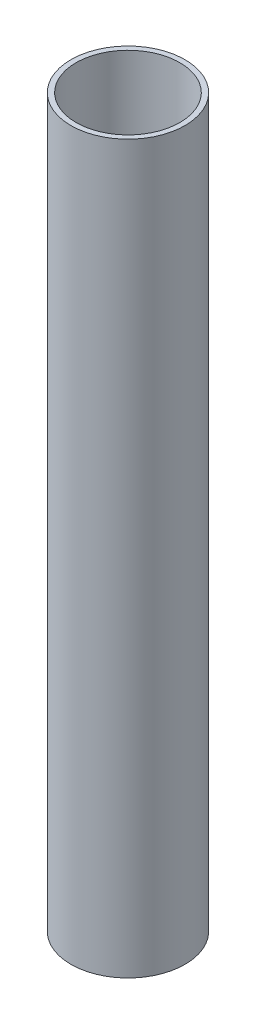
ISO-10303-21;
HEADER;
FILE_DESCRIPTION(('STEP AP214'),'2;1');
FILE_NAME('part.step','',(''),(''),'','','');
FILE_SCHEMA(('AUTOMOTIVE_DESIGN { 1 0 10303 214 1 1 1 1 }'));
ENDSEC;
DATA;
#1=APPLICATION_CONTEXT('core data for automotive mechanical design processes');
#2=APPLICATION_PROTOCOL_DEFINITION('international standard','automotive_design',2000,#1);
#3=PRODUCT_CONTEXT('',#1,'mechanical');
#4=PRODUCT('Part','Part','',(#3));
#5=PRODUCT_RELATED_PRODUCT_CATEGORY('part','',(#4));
#6=PRODUCT_DEFINITION_FORMATION('','',#4);
#7=PRODUCT_DEFINITION_CONTEXT('part definition',#1,'design');
#8=PRODUCT_DEFINITION('design','',#6,#7);
#9=PRODUCT_DEFINITION_SHAPE('','',#8);
#10=(LENGTH_UNIT() NAMED_UNIT(*) SI_UNIT(.MILLI.,.METRE.));
#11=(NAMED_UNIT(*) PLANE_ANGLE_UNIT() SI_UNIT($,.RADIAN.));
#12=(NAMED_UNIT(*) SI_UNIT($,.STERADIAN.) SOLID_ANGLE_UNIT());
#13=UNCERTAINTY_MEASURE_WITH_UNIT(LENGTH_MEASURE(1.E-05),#10,'distance_accuracy_value','');
#14=(GEOMETRIC_REPRESENTATION_CONTEXT(3) GLOBAL_UNCERTAINTY_ASSIGNED_CONTEXT((#13)) GLOBAL_UNIT_ASSIGNED_CONTEXT((#10,
#11,#12)) REPRESENTATION_CONTEXT('',''));
#15=CARTESIAN_POINT('',(0.,0.,0.));
#16=DIRECTION('',(0.,0.,1.));
#17=DIRECTION('',(1.,0.,0.));
#18=AXIS2_PLACEMENT_3D('',#15,#16,#17);
#19=CARTESIAN_POINT('',(0.,700.,0.));
#20=DIRECTION('',(0.,1.,0.));
#21=DIRECTION('',(0.,0.,1.));
#22=AXIS2_PLACEMENT_3D('',#19,#20,#21);
#23=PLANE('',#22);
#24=CARTESIAN_POINT('',(0.,700.,0.));
#25=DIRECTION('',(0.,1.,0.));
#26=DIRECTION('',(0.,0.,1.));
#27=AXIS2_PLACEMENT_3D('',#24,#25,#26);
#28=CIRCLE('',#27,55.);
#29=CARTESIAN_POINT('',(0.,700.,55.));
#30=VERTEX_POINT('',#29);
#31=EDGE_CURVE('E10',#30,#30,#28,.T.);
#32=ORIENTED_EDGE('',*,*,#31,.T.);
#33=EDGE_LOOP('',(#32));
#34=FACE_BOUND('',#33,.T.);
#35=CARTESIAN_POINT('',(0.,700.,0.));
#36=DIRECTION('',(0.,1.,0.));
#37=DIRECTION('',(0.,0.,1.));
#38=AXIS2_PLACEMENT_3D('',#35,#36,#37);
#39=CIRCLE('',#38,50.);
#40=CARTESIAN_POINT('',(0.,700.,50.));
#41=VERTEX_POINT('',#40);
#42=EDGE_CURVE('E56',#41,#41,#39,.T.);
#43=ORIENTED_EDGE('',*,*,#42,.F.);
#44=EDGE_LOOP('',(#43));
#45=FACE_BOUND('',#44,.T.);
#46=ADVANCED_FACE('F43',(#34,#45),#23,.T.);
#47=CARTESIAN_POINT('',(0.,0.,0.));
#48=DIRECTION('',(0.,1.,0.));
#49=DIRECTION('',(0.,0.,1.));
#50=AXIS2_PLACEMENT_3D('',#47,#48,#49);
#51=PLANE('',#50);
#52=CARTESIAN_POINT('',(0.,0.,0.));
#53=DIRECTION('',(0.,1.,0.));
#54=DIRECTION('',(0.,0.,1.));
#55=AXIS2_PLACEMENT_3D('',#52,#53,#54);
#56=CIRCLE('',#55,55.);
#57=CARTESIAN_POINT('',(0.,0.,55.));
#58=VERTEX_POINT('',#57);
#59=EDGE_CURVE('E47',#58,#58,#56,.T.);
#60=ORIENTED_EDGE('',*,*,#59,.F.);
#61=EDGE_LOOP('',(#60));
#62=FACE_BOUND('',#61,.T.);
#63=CARTESIAN_POINT('',(0.,0.,0.));
#64=DIRECTION('',(0.,1.,0.));
#65=DIRECTION('',(0.,0.,1.));
#66=AXIS2_PLACEMENT_3D('',#63,#64,#65);
#67=CIRCLE('',#66,50.);
#68=CARTESIAN_POINT('',(0.,0.,50.));
#69=VERTEX_POINT('',#68);
#70=EDGE_CURVE('E58',#69,#69,#67,.T.);
#71=ORIENTED_EDGE('',*,*,#70,.T.);
#72=EDGE_LOOP('',(#71));
#73=FACE_BOUND('',#72,.T.);
#74=ADVANCED_FACE('F70',(#62,#73),#51,.F.);
#75=CARTESIAN_POINT('',(0.,700.,0.));
#76=DIRECTION('',(0.,-1.,0.));
#77=DIRECTION('',(0.,0.,-1.));
#78=AXIS2_PLACEMENT_3D('',#75,#76,#77);
#79=CYLINDRICAL_SURFACE('',#78,55.);
#80=ORIENTED_EDGE('',*,*,#31,.F.);
#81=EDGE_LOOP('',(#80));
#82=FACE_BOUND('',#81,.T.);
#83=ORIENTED_EDGE('',*,*,#59,.T.);
#84=EDGE_LOOP('',(#83));
#85=FACE_BOUND('',#84,.T.);
#86=ADVANCED_FACE('F45',(#82,#85),#79,.T.);
#87=CARTESIAN_POINT('',(0.,700.,0.));
#88=DIRECTION('',(0.,-1.,0.));
#89=DIRECTION('',(0.,0.,-1.));
#90=AXIS2_PLACEMENT_3D('',#87,#88,#89);
#91=CYLINDRICAL_SURFACE('',#90,50.);
#92=ORIENTED_EDGE('',*,*,#42,.T.);
#93=EDGE_LOOP('',(#92));
#94=FACE_BOUND('',#93,.T.);
#95=ORIENTED_EDGE('',*,*,#70,.F.);
#96=EDGE_LOOP('',(#95));
#97=FACE_BOUND('',#96,.T.);
#98=ADVANCED_FACE('F66',(#94,#97),#91,.F.);
#99=CLOSED_SHELL('',(#46,#74,#86,#98));
#100=MANIFOLD_SOLID_BREP('B2',#99);
#101=ADVANCED_BREP_SHAPE_REPRESENTATION('',(#18,#100),#14);
#102=SHAPE_DEFINITION_REPRESENTATION(#9,#101);
ENDSEC;
END-ISO-10303-21;
